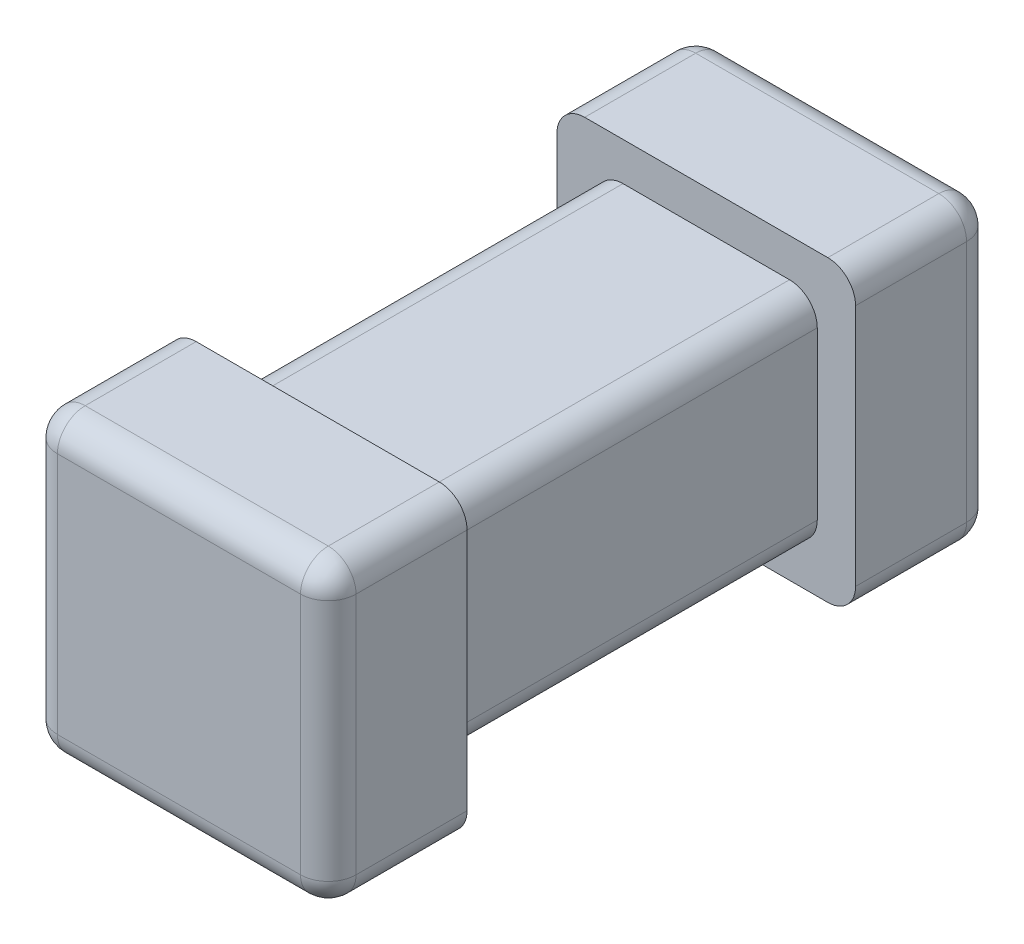
ISO-10303-21;
HEADER;
FILE_DESCRIPTION(('STEP AP214'),'2;1');
FILE_NAME('part.step','',(''),(''),'','','');
FILE_SCHEMA(('AUTOMOTIVE_DESIGN { 1 0 10303 214 1 1 1 1 }'));
ENDSEC;
DATA;
#1=APPLICATION_CONTEXT('core data for automotive mechanical design processes');
#2=APPLICATION_PROTOCOL_DEFINITION('international standard','automotive_design',2000,#1);
#3=PRODUCT_CONTEXT('',#1,'mechanical');
#4=PRODUCT('Part','Part','',(#3));
#5=PRODUCT_RELATED_PRODUCT_CATEGORY('part','',(#4));
#6=PRODUCT_DEFINITION_FORMATION('','',#4);
#7=PRODUCT_DEFINITION_CONTEXT('part definition',#1,'design');
#8=PRODUCT_DEFINITION('design','',#6,#7);
#9=PRODUCT_DEFINITION_SHAPE('','',#8);
#10=(LENGTH_UNIT() NAMED_UNIT(*) SI_UNIT(.MILLI.,.METRE.));
#11=(NAMED_UNIT(*) PLANE_ANGLE_UNIT() SI_UNIT($,.RADIAN.));
#12=(NAMED_UNIT(*) SI_UNIT($,.STERADIAN.) SOLID_ANGLE_UNIT());
#13=UNCERTAINTY_MEASURE_WITH_UNIT(LENGTH_MEASURE(1.E-05),#10,'distance_accuracy_value','');
#14=(GEOMETRIC_REPRESENTATION_CONTEXT(3) GLOBAL_UNCERTAINTY_ASSIGNED_CONTEXT((#13)) GLOBAL_UNIT_ASSIGNED_CONTEXT((#10,
#11,#12)) REPRESENTATION_CONTEXT('',''));
#15=CARTESIAN_POINT('',(0.,0.,0.));
#16=DIRECTION('',(0.,0.,1.));
#17=DIRECTION('',(1.,0.,0.));
#18=AXIS2_PLACEMENT_3D('',#15,#16,#17);
#19=CARTESIAN_POINT('',(0.,0.,0.));
#20=DIRECTION('',(0.,0.,-1.));
#21=DIRECTION('',(-1.,0.,0.));
#22=AXIS2_PLACEMENT_3D('',#19,#20,#21);
#23=PLANE('',#22);
#24=DIRECTION('',(1.,0.,0.));
#25=VECTOR('',#24,1.);
#26=CARTESIAN_POINT('',(0.,2.44,0.));
#27=LINE('',#26,#25);
#28=CARTESIAN_POINT('',(0.25,2.44,0.));
#29=VERTEX_POINT('',#28);
#30=CARTESIAN_POINT('',(2.44,2.44,0.));
#31=VERTEX_POINT('',#30);
#32=EDGE_CURVE('E260',#29,#31,#27,.T.);
#33=ORIENTED_EDGE('',*,*,#32,.F.);
#34=DIRECTION('',(0.,1.,0.));
#35=VECTOR('',#34,1.);
#36=CARTESIAN_POINT('',(0.25,0.,0.));
#37=LINE('',#36,#35);
#38=CARTESIAN_POINT('',(0.25,0.25,0.));
#39=VERTEX_POINT('',#38);
#40=EDGE_CURVE('E271',#39,#29,#37,.T.);
#41=ORIENTED_EDGE('',*,*,#40,.F.);
#42=DIRECTION('',(-1.,0.,0.));
#43=VECTOR('',#42,1.);
#44=CARTESIAN_POINT('',(0.,0.25,0.));
#45=LINE('',#44,#43);
#46=CARTESIAN_POINT('',(2.44,0.249999999999904,0.));
#47=VERTEX_POINT('',#46);
#48=EDGE_CURVE('E277',#47,#39,#45,.T.);
#49=ORIENTED_EDGE('',*,*,#48,.F.);
#50=DIRECTION('',(0.,-1.,0.));
#51=VECTOR('',#50,1.);
#52=CARTESIAN_POINT('',(2.44,0.,0.));
#53=LINE('',#52,#51);
#54=EDGE_CURVE('E265',#31,#47,#53,.T.);
#55=ORIENTED_EDGE('',*,*,#54,.F.);
#56=EDGE_LOOP('',(#33,#41,#49,#55));
#57=FACE_BOUND('',#56,.T.);
#58=ADVANCED_FACE('F16',(#57),#23,.F.);
#59=CARTESIAN_POINT('',(0.,0.,-6.));
#60=DIRECTION('',(0.,0.,1.));
#61=DIRECTION('',(1.,0.,0.));
#62=AXIS2_PLACEMENT_3D('',#59,#60,#61);
#63=PLANE('',#62);
#64=DIRECTION('',(-1.,0.,0.));
#65=VECTOR('',#64,1.);
#66=CARTESIAN_POINT('',(0.,0.25,-6.));
#67=LINE('',#66,#65);
#68=CARTESIAN_POINT('',(0.25,0.249999999999904,-6.));
#69=VERTEX_POINT('',#68);
#70=CARTESIAN_POINT('',(2.44,0.25,-6.));
#71=VERTEX_POINT('',#70);
#72=EDGE_CURVE('E442',#69,#71,#67,.F.);
#73=ORIENTED_EDGE('',*,*,#72,.F.);
#74=DIRECTION('',(0.,1.,0.));
#75=VECTOR('',#74,1.);
#76=CARTESIAN_POINT('',(0.25,0.,-6.));
#77=LINE('',#76,#75);
#78=CARTESIAN_POINT('',(0.25,2.44,-6.));
#79=VERTEX_POINT('',#78);
#80=EDGE_CURVE('E776',#79,#69,#77,.F.);
#81=ORIENTED_EDGE('',*,*,#80,.F.);
#82=DIRECTION('',(1.,0.,0.));
#83=VECTOR('',#82,1.);
#84=CARTESIAN_POINT('',(0.,2.44,-6.));
#85=LINE('',#84,#83);
#86=CARTESIAN_POINT('',(2.44,2.44,-6.));
#87=VERTEX_POINT('',#86);
#88=EDGE_CURVE('E491',#87,#79,#85,.F.);
#89=ORIENTED_EDGE('',*,*,#88,.F.);
#90=DIRECTION('',(0.,-1.,0.));
#91=VECTOR('',#90,1.);
#92=CARTESIAN_POINT('',(2.44,0.,-6.));
#93=LINE('',#92,#91);
#94=EDGE_CURVE('E243',#71,#87,#93,.F.);
#95=ORIENTED_EDGE('',*,*,#94,.F.);
#96=EDGE_LOOP('',(#73,#81,#89,#95));
#97=FACE_BOUND('',#96,.T.);
#98=ADVANCED_FACE('F320',(#97),#63,.F.);
#99=CARTESIAN_POINT('',(2.345,2.345,-3.));
#100=DIRECTION('',(-1.,0.,0.));
#101=DIRECTION('',(0.,-1.,0.));
#102=AXIS2_PLACEMENT_3D('',#99,#100,#101);
#103=PLANE('',#102);
#104=DIRECTION('',(0.,0.,1.));
#105=VECTOR('',#104,1.);
#106=CARTESIAN_POINT('',(2.345,0.595,-3.));
#107=LINE('',#106,#105);
#108=CARTESIAN_POINT('',(2.345,0.595,-4.75));
#109=VERTEX_POINT('',#108);
#110=CARTESIAN_POINT('',(2.345,0.595,-1.25));
#111=VERTEX_POINT('',#110);
#112=EDGE_CURVE('E244',#109,#111,#107,.T.);
#113=ORIENTED_EDGE('',*,*,#112,.F.);
#114=DIRECTION('',(0.,-1.,0.));
#115=VECTOR('',#114,1.);
#116=CARTESIAN_POINT('',(2.345,2.345,-4.75));
#117=LINE('',#116,#115);
#118=CARTESIAN_POINT('',(2.345,2.095,-4.75));
#119=VERTEX_POINT('',#118);
#120=EDGE_CURVE('E1109',#119,#109,#117,.T.);
#121=ORIENTED_EDGE('',*,*,#120,.F.);
#122=DIRECTION('',(0.,0.,1.));
#123=VECTOR('',#122,1.);
#124=CARTESIAN_POINT('',(2.345,2.095,-3.));
#125=LINE('',#124,#123);
#126=CARTESIAN_POINT('',(2.345,2.095,-1.25));
#127=VERTEX_POINT('',#126);
#128=EDGE_CURVE('E241',#127,#119,#125,.F.);
#129=ORIENTED_EDGE('',*,*,#128,.F.);
#130=DIRECTION('',(0.,-1.,0.));
#131=VECTOR('',#130,1.);
#132=CARTESIAN_POINT('',(2.345,2.345,-1.25));
#133=LINE('',#132,#131);
#134=EDGE_CURVE('E268',#111,#127,#133,.F.);
#135=ORIENTED_EDGE('',*,*,#134,.F.);
#136=EDGE_LOOP('',(#113,#121,#129,#135));
#137=FACE_BOUND('',#136,.T.);
#138=ADVANCED_FACE('F317',(#137),#103,.F.);
#139=CARTESIAN_POINT('',(2.44,0.,-0.25));
#140=DIRECTION('',(0.,-1.,0.));
#141=DIRECTION('',(0.,0.,-1.));
#142=AXIS2_PLACEMENT_3D('',#139,#140,#141);
#143=CYLINDRICAL_SURFACE('',#142,0.25);
#144=CARTESIAN_POINT('',(2.44,2.44,-0.25));
#145=DIRECTION('',(0.,-1.,0.));
#146=DIRECTION('',(1.,0.,0.));
#147=AXIS2_PLACEMENT_3D('',#144,#145,#146);
#148=CIRCLE('',#147,0.25);
#149=CARTESIAN_POINT('',(2.69,2.44,-0.25));
#150=VERTEX_POINT('',#149);
#151=EDGE_CURVE('E139',#31,#150,#148,.F.);
#152=ORIENTED_EDGE('',*,*,#151,.F.);
#153=ORIENTED_EDGE('',*,*,#54,.T.);
#154=CARTESIAN_POINT('',(2.44,0.25,-0.25));
#155=DIRECTION('',(0.,-1.,-1.5328734877225E-12));
#156=DIRECTION('',(1.,0.,0.));
#157=AXIS2_PLACEMENT_3D('',#154,#155,#156);
#158=CIRCLE('',#157,0.25);
#159=CARTESIAN_POINT('',(2.69,0.25,-0.25));
#160=VERTEX_POINT('',#159);
#161=EDGE_CURVE('E267',#160,#47,#158,.T.);
#162=ORIENTED_EDGE('',*,*,#161,.F.);
#163=DIRECTION('',(0.,1.,0.));
#164=VECTOR('',#163,1.);
#165=CARTESIAN_POINT('',(2.69,0.,-0.25));
#166=LINE('',#165,#164);
#167=EDGE_CURVE('E239',#150,#160,#166,.F.);
#168=ORIENTED_EDGE('',*,*,#167,.F.);
#169=EDGE_LOOP('',(#152,#153,#162,#168));
#170=FACE_BOUND('',#169,.T.);
#171=ADVANCED_FACE('F312',(#170),#143,.T.);
#172=CARTESIAN_POINT('',(2.44,0.25,-0.25));
#173=DIRECTION('',(1.,0.,0.));
#174=DIRECTION('',(0.,0.,-1.));
#175=AXIS2_PLACEMENT_3D('',#172,#173,#174);
#176=SPHERICAL_SURFACE('',#175,0.25);
#177=CARTESIAN_POINT('',(2.44,0.25,-0.25));
#178=DIRECTION('',(0.,0.,1.));
#179=DIRECTION('',(1.,0.,0.));
#180=AXIS2_PLACEMENT_3D('',#177,#178,#179);
#181=CIRCLE('',#180,0.25);
#182=CARTESIAN_POINT('',(2.44,0.,-0.25));
#183=VERTEX_POINT('',#182);
#184=EDGE_CURVE('E298',#160,#183,#181,.F.);
#185=ORIENTED_EDGE('',*,*,#184,.F.);
#186=ORIENTED_EDGE('',*,*,#161,.T.);
#187=CARTESIAN_POINT('',(2.44,0.25,-0.25));
#188=DIRECTION('',(-1.,0.,0.));
#189=DIRECTION('',(0.,0.,1.));
#190=AXIS2_PLACEMENT_3D('',#187,#188,#189);
#191=CIRCLE('',#190,0.25);
#192=EDGE_CURVE('E279',#183,#47,#191,.T.);
#193=ORIENTED_EDGE('',*,*,#192,.F.);
#194=EDGE_LOOP('',(#185,#186,#193));
#195=FACE_BOUND('',#194,.T.);
#196=ADVANCED_FACE('F307',(#195),#176,.T.);
#197=CARTESIAN_POINT('',(0.,0.25,-0.25));
#198=DIRECTION('',(-1.,0.,0.));
#199=DIRECTION('',(0.,0.,1.));
#200=AXIS2_PLACEMENT_3D('',#197,#198,#199);
#201=CYLINDRICAL_SURFACE('',#200,0.25);
#202=ORIENTED_EDGE('',*,*,#192,.T.);
#203=ORIENTED_EDGE('',*,*,#48,.T.);
#204=CARTESIAN_POINT('',(0.25,0.25,-0.25));
#205=DIRECTION('',(1.,0.,0.));
#206=DIRECTION('',(0.,0.,-1.));
#207=AXIS2_PLACEMENT_3D('',#204,#205,#206);
#208=CIRCLE('',#207,0.25);
#209=CARTESIAN_POINT('',(0.25,0.,-0.25));
#210=VERTEX_POINT('',#209);
#211=EDGE_CURVE('E278',#210,#39,#208,.F.);
#212=ORIENTED_EDGE('',*,*,#211,.F.);
#213=DIRECTION('',(1.,0.,0.));
#214=VECTOR('',#213,1.);
#215=CARTESIAN_POINT('',(0.,0.,-0.25));
#216=LINE('',#215,#214);
#217=EDGE_CURVE('E576',#183,#210,#216,.F.);
#218=ORIENTED_EDGE('',*,*,#217,.F.);
#219=EDGE_LOOP('',(#202,#203,#212,#218));
#220=FACE_BOUND('',#219,.T.);
#221=ADVANCED_FACE('F311',(#220),#201,.T.);
#222=CARTESIAN_POINT('',(0.25,0.25,-0.25));
#223=DIRECTION('',(1.,0.,0.));
#224=DIRECTION('',(0.,0.,-1.));
#225=AXIS2_PLACEMENT_3D('',#222,#223,#224);
#226=SPHERICAL_SURFACE('',#225,0.25);
#227=ORIENTED_EDGE('',*,*,#211,.T.);
#228=CARTESIAN_POINT('',(0.25,0.25,-0.25));
#229=DIRECTION('',(0.,1.,0.));
#230=DIRECTION('',(0.,0.,1.));
#231=AXIS2_PLACEMENT_3D('',#228,#229,#230);
#232=CIRCLE('',#231,0.25);
#233=CARTESIAN_POINT('',(0.,0.25,-0.25));
#234=VERTEX_POINT('',#233);
#235=EDGE_CURVE('E274',#234,#39,#232,.T.);
#236=ORIENTED_EDGE('',*,*,#235,.F.);
#237=CARTESIAN_POINT('',(0.25,0.25,-0.25));
#238=DIRECTION('',(0.,0.,1.));
#239=DIRECTION('',(1.,0.,0.));
#240=AXIS2_PLACEMENT_3D('',#237,#238,#239);
#241=CIRCLE('',#240,0.25);
#242=EDGE_CURVE('E581',#210,#234,#241,.F.);
#243=ORIENTED_EDGE('',*,*,#242,.F.);
#244=EDGE_LOOP('',(#227,#236,#243));
#245=FACE_BOUND('',#244,.T.);
#246=ADVANCED_FACE('F565',(#245),#226,.T.);
#247=CARTESIAN_POINT('',(0.25,0.,-0.25));
#248=DIRECTION('',(0.,1.,0.));
#249=DIRECTION('',(0.,0.,1.));
#250=AXIS2_PLACEMENT_3D('',#247,#248,#249);
#251=CYLINDRICAL_SURFACE('',#250,0.25);
#252=CARTESIAN_POINT('',(0.25,2.44,-0.25));
#253=DIRECTION('',(0.,-1.,0.));
#254=DIRECTION('',(1.,0.,0.));
#255=AXIS2_PLACEMENT_3D('',#252,#253,#254);
#256=CIRCLE('',#255,0.25);
#257=CARTESIAN_POINT('',(0.,2.44,-0.25));
#258=VERTEX_POINT('',#257);
#259=EDGE_CURVE('E273',#258,#29,#256,.F.);
#260=ORIENTED_EDGE('',*,*,#259,.F.);
#261=DIRECTION('',(0.,1.,0.));
#262=VECTOR('',#261,1.);
#263=CARTESIAN_POINT('',(0.,0.,-0.25));
#264=LINE('',#263,#262);
#265=EDGE_CURVE('E663',#234,#258,#264,.T.);
#266=ORIENTED_EDGE('',*,*,#265,.F.);
#267=ORIENTED_EDGE('',*,*,#235,.T.);
#268=ORIENTED_EDGE('',*,*,#40,.T.);
#269=EDGE_LOOP('',(#260,#266,#267,#268));
#270=FACE_BOUND('',#269,.T.);
#271=ADVANCED_FACE('F562',(#270),#251,.T.);
#272=CARTESIAN_POINT('',(0.25,2.44,-0.25));
#273=DIRECTION('',(1.,0.,0.));
#274=DIRECTION('',(0.,0.,-1.));
#275=AXIS2_PLACEMENT_3D('',#272,#273,#274);
#276=SPHERICAL_SURFACE('',#275,0.25);
#277=ORIENTED_EDGE('',*,*,#259,.T.);
#278=CARTESIAN_POINT('',(0.25,2.44,-0.25));
#279=DIRECTION('',(1.,0.,0.));
#280=DIRECTION('',(0.,0.,-1.));
#281=AXIS2_PLACEMENT_3D('',#278,#279,#280);
#282=CIRCLE('',#281,0.25);
#283=CARTESIAN_POINT('',(0.25,2.69,-0.25));
#284=VERTEX_POINT('',#283);
#285=EDGE_CURVE('E262',#284,#29,#282,.T.);
#286=ORIENTED_EDGE('',*,*,#285,.F.);
#287=CARTESIAN_POINT('',(0.25,2.44,-0.25));
#288=DIRECTION('',(0.,0.,1.));
#289=DIRECTION('',(1.,0.,0.));
#290=AXIS2_PLACEMENT_3D('',#287,#288,#289);
#291=CIRCLE('',#290,0.25);
#292=EDGE_CURVE('E545',#258,#284,#291,.F.);
#293=ORIENTED_EDGE('',*,*,#292,.F.);
#294=EDGE_LOOP('',(#277,#286,#293));
#295=FACE_BOUND('',#294,.T.);
#296=ADVANCED_FACE('F559',(#295),#276,.T.);
#297=CARTESIAN_POINT('',(0.,2.44,-0.25));
#298=DIRECTION('',(1.,0.,0.));
#299=DIRECTION('',(0.,0.,-1.));
#300=AXIS2_PLACEMENT_3D('',#297,#298,#299);
#301=CYLINDRICAL_SURFACE('',#300,0.25);
#302=ORIENTED_EDGE('',*,*,#285,.T.);
#303=ORIENTED_EDGE('',*,*,#32,.T.);
#304=CARTESIAN_POINT('',(2.44,2.44,-0.25));
#305=DIRECTION('',(1.,0.,0.));
#306=DIRECTION('',(0.,0.,-1.));
#307=AXIS2_PLACEMENT_3D('',#304,#305,#306);
#308=CIRCLE('',#307,0.25);
#309=CARTESIAN_POINT('',(2.44,2.69,-0.25));
#310=VERTEX_POINT('',#309);
#311=EDGE_CURVE('E255',#310,#31,#308,.T.);
#312=ORIENTED_EDGE('',*,*,#311,.F.);
#313=DIRECTION('',(1.,0.,0.));
#314=VECTOR('',#313,1.);
#315=CARTESIAN_POINT('',(0.,2.69,-0.25));
#316=LINE('',#315,#314);
#317=EDGE_CURVE('E542',#284,#310,#316,.T.);
#318=ORIENTED_EDGE('',*,*,#317,.F.);
#319=EDGE_LOOP('',(#302,#303,#312,#318));
#320=FACE_BOUND('',#319,.T.);
#321=ADVANCED_FACE('F529',(#320),#301,.T.);
#322=CARTESIAN_POINT('',(2.44,2.44,-0.25));
#323=DIRECTION('',(1.,0.,0.));
#324=DIRECTION('',(0.,0.,-1.));
#325=AXIS2_PLACEMENT_3D('',#322,#323,#324);
#326=SPHERICAL_SURFACE('',#325,0.25);
#327=CARTESIAN_POINT('',(2.44,2.44,-0.25));
#328=DIRECTION('',(0.,0.,1.));
#329=DIRECTION('',(1.,0.,0.));
#330=AXIS2_PLACEMENT_3D('',#327,#328,#329);
#331=CIRCLE('',#330,0.25);
#332=EDGE_CURVE('E649',#310,#150,#331,.F.);
#333=ORIENTED_EDGE('',*,*,#332,.F.);
#334=ORIENTED_EDGE('',*,*,#311,.T.);
#335=ORIENTED_EDGE('',*,*,#151,.T.);
#336=EDGE_LOOP('',(#333,#334,#335));
#337=FACE_BOUND('',#336,.T.);
#338=ADVANCED_FACE('F525',(#337),#326,.T.);
#339=CARTESIAN_POINT('',(2.095,0.595,-3.));
#340=DIRECTION('',(0.,0.,1.));
#341=DIRECTION('',(1.,0.,0.));
#342=AXIS2_PLACEMENT_3D('',#339,#340,#341);
#343=CYLINDRICAL_SURFACE('',#342,0.25);
#344=ORIENTED_EDGE('',*,*,#112,.T.);
#345=CARTESIAN_POINT('',(2.095,0.595,-1.25));
#346=DIRECTION('',(0.,0.,1.));
#347=DIRECTION('',(1.,0.,0.));
#348=AXIS2_PLACEMENT_3D('',#345,#346,#347);
#349=CIRCLE('',#348,0.25);
#350=CARTESIAN_POINT('',(2.095,0.345,-1.25));
#351=VERTEX_POINT('',#350);
#352=EDGE_CURVE('E242',#111,#351,#349,.F.);
#353=ORIENTED_EDGE('',*,*,#352,.T.);
#354=DIRECTION('',(0.,0.,1.));
#355=VECTOR('',#354,1.);
#356=CARTESIAN_POINT('',(2.095,0.345,-3.));
#357=LINE('',#356,#355);
#358=CARTESIAN_POINT('',(2.095,0.345,-4.75));
#359=VERTEX_POINT('',#358);
#360=EDGE_CURVE('E645',#351,#359,#357,.F.);
#361=ORIENTED_EDGE('',*,*,#360,.T.);
#362=CARTESIAN_POINT('',(2.095,0.595,-4.75));
#363=DIRECTION('',(0.,0.,1.));
#364=DIRECTION('',(1.,0.,0.));
#365=AXIS2_PLACEMENT_3D('',#362,#363,#364);
#366=CIRCLE('',#365,0.25);
#367=EDGE_CURVE('E19',#359,#109,#366,.T.);
#368=ORIENTED_EDGE('',*,*,#367,.T.);
#369=EDGE_LOOP('',(#344,#353,#361,#368));
#370=FACE_BOUND('',#369,.T.);
#371=ADVANCED_FACE('F521',(#370),#343,.T.);
#372=CARTESIAN_POINT('',(2.44,0.,-5.75));
#373=DIRECTION('',(0.,-1.,0.));
#374=DIRECTION('',(0.,0.,-1.));
#375=AXIS2_PLACEMENT_3D('',#372,#373,#374);
#376=CYLINDRICAL_SURFACE('',#375,0.25);
#377=CARTESIAN_POINT('',(2.44,2.44,-5.75));
#378=DIRECTION('',(0.,1.,0.));
#379=DIRECTION('',(1.,0.,0.));
#380=AXIS2_PLACEMENT_3D('',#377,#378,#379);
#381=CIRCLE('',#380,0.25);
#382=CARTESIAN_POINT('',(2.69,2.44,-5.75));
#383=VERTEX_POINT('',#382);
#384=EDGE_CURVE('E251',#383,#87,#381,.T.);
#385=ORIENTED_EDGE('',*,*,#384,.F.);
#386=DIRECTION('',(0.,1.,0.));
#387=VECTOR('',#386,1.);
#388=CARTESIAN_POINT('',(2.69,0.,-5.75));
#389=LINE('',#388,#387);
#390=CARTESIAN_POINT('',(2.69,0.25,-5.75));
#391=VERTEX_POINT('',#390);
#392=EDGE_CURVE('E595',#391,#383,#389,.T.);
#393=ORIENTED_EDGE('',*,*,#392,.F.);
#394=CARTESIAN_POINT('',(2.44,0.25,-5.75));
#395=DIRECTION('',(0.,1.,0.));
#396=DIRECTION('',(1.,0.,0.));
#397=AXIS2_PLACEMENT_3D('',#394,#395,#396);
#398=CIRCLE('',#397,0.25);
#399=EDGE_CURVE('E434',#71,#391,#398,.F.);
#400=ORIENTED_EDGE('',*,*,#399,.F.);
#401=ORIENTED_EDGE('',*,*,#94,.T.);
#402=EDGE_LOOP('',(#385,#393,#400,#401));
#403=FACE_BOUND('',#402,.T.);
#404=ADVANCED_FACE('F517',(#403),#376,.T.);
#405=CARTESIAN_POINT('',(2.44,2.44,-5.75));
#406=DIRECTION('',(1.,0.,0.));
#407=DIRECTION('',(0.,0.,1.));
#408=AXIS2_PLACEMENT_3D('',#405,#406,#407);
#409=SPHERICAL_SURFACE('',#408,0.25);
#410=CARTESIAN_POINT('',(2.44,2.44,-5.75));
#411=DIRECTION('',(1.,0.,0.));
#412=DIRECTION('',(0.,0.,-1.));
#413=AXIS2_PLACEMENT_3D('',#410,#411,#412);
#414=CIRCLE('',#413,0.25);
#415=CARTESIAN_POINT('',(2.44,2.69,-5.75));
#416=VERTEX_POINT('',#415);
#417=EDGE_CURVE('E506',#416,#87,#414,.F.);
#418=ORIENTED_EDGE('',*,*,#417,.F.);
#419=CARTESIAN_POINT('',(2.44,2.44,-5.75));
#420=DIRECTION('',(0.,0.,-1.));
#421=DIRECTION('',(-1.,0.,0.));
#422=AXIS2_PLACEMENT_3D('',#419,#420,#421);
#423=CIRCLE('',#422,0.25);
#424=EDGE_CURVE('E498',#383,#416,#423,.F.);
#425=ORIENTED_EDGE('',*,*,#424,.F.);
#426=ORIENTED_EDGE('',*,*,#384,.T.);
#427=EDGE_LOOP('',(#418,#425,#426));
#428=FACE_BOUND('',#427,.T.);
#429=ADVANCED_FACE('F514',(#428),#409,.T.);
#430=CARTESIAN_POINT('',(0.,2.44,-5.75));
#431=DIRECTION('',(1.,0.,0.));
#432=DIRECTION('',(0.,0.,-1.));
#433=AXIS2_PLACEMENT_3D('',#430,#431,#432);
#434=CYLINDRICAL_SURFACE('',#433,0.25);
#435=CARTESIAN_POINT('',(0.25,2.44,-5.75));
#436=DIRECTION('',(1.,0.,0.));
#437=DIRECTION('',(0.,0.,1.));
#438=AXIS2_PLACEMENT_3D('',#435,#436,#437);
#439=CIRCLE('',#438,0.25);
#440=CARTESIAN_POINT('',(0.25,2.69,-5.75));
#441=VERTEX_POINT('',#440);
#442=EDGE_CURVE('E487',#441,#79,#439,.F.);
#443=ORIENTED_EDGE('',*,*,#442,.F.);
#444=DIRECTION('',(1.,0.,0.));
#445=VECTOR('',#444,1.);
#446=CARTESIAN_POINT('',(0.,2.69,-5.75));
#447=LINE('',#446,#445);
#448=EDGE_CURVE('E494',#416,#441,#447,.F.);
#449=ORIENTED_EDGE('',*,*,#448,.F.);
#450=ORIENTED_EDGE('',*,*,#417,.T.);
#451=ORIENTED_EDGE('',*,*,#88,.T.);
#452=EDGE_LOOP('',(#443,#449,#450,#451));
#453=FACE_BOUND('',#452,.T.);
#454=ADVANCED_FACE('F479',(#453),#434,.T.);
#455=CARTESIAN_POINT('',(0.25,2.44,-5.75));
#456=DIRECTION('',(1.,0.,0.));
#457=DIRECTION('',(0.,0.,1.));
#458=AXIS2_PLACEMENT_3D('',#455,#456,#457);
#459=SPHERICAL_SURFACE('',#458,0.25);
#460=ORIENTED_EDGE('',*,*,#442,.T.);
#461=CARTESIAN_POINT('',(0.25,2.44,-5.75));
#462=DIRECTION('',(0.,1.,0.));
#463=DIRECTION('',(0.,0.,1.));
#464=AXIS2_PLACEMENT_3D('',#461,#462,#463);
#465=CIRCLE('',#464,0.25);
#466=CARTESIAN_POINT('',(0.,2.44,-5.75));
#467=VERTEX_POINT('',#466);
#468=EDGE_CURVE('E490',#467,#79,#465,.F.);
#469=ORIENTED_EDGE('',*,*,#468,.F.);
#470=CARTESIAN_POINT('',(0.25,2.44,-5.75));
#471=DIRECTION('',(0.,0.,-1.));
#472=DIRECTION('',(-1.,0.,0.));
#473=AXIS2_PLACEMENT_3D('',#470,#471,#472);
#474=CIRCLE('',#473,0.25);
#475=EDGE_CURVE('E628',#441,#467,#474,.F.);
#476=ORIENTED_EDGE('',*,*,#475,.F.);
#477=EDGE_LOOP('',(#460,#469,#476));
#478=FACE_BOUND('',#477,.T.);
#479=ADVANCED_FACE('F474',(#478),#459,.T.);
#480=CARTESIAN_POINT('',(0.25,0.,-5.75));
#481=DIRECTION('',(0.,1.,0.));
#482=DIRECTION('',(0.,0.,1.));
#483=AXIS2_PLACEMENT_3D('',#480,#481,#482);
#484=CYLINDRICAL_SURFACE('',#483,0.25);
#485=ORIENTED_EDGE('',*,*,#468,.T.);
#486=ORIENTED_EDGE('',*,*,#80,.T.);
#487=CARTESIAN_POINT('',(0.25,0.25,-5.75));
#488=DIRECTION('',(0.,1.,-1.53311841708233E-12));
#489=DIRECTION('',(1.,0.,0.));
#490=AXIS2_PLACEMENT_3D('',#487,#488,#489);
#491=CIRCLE('',#490,0.25);
#492=CARTESIAN_POINT('',(0.,0.25,-5.75));
#493=VERTEX_POINT('',#492);
#494=EDGE_CURVE('E455',#493,#69,#491,.F.);
#495=ORIENTED_EDGE('',*,*,#494,.F.);
#496=DIRECTION('',(0.,1.,0.));
#497=VECTOR('',#496,1.);
#498=CARTESIAN_POINT('',(0.,0.,-5.75));
#499=LINE('',#498,#497);
#500=EDGE_CURVE('E622',#467,#493,#499,.F.);
#501=ORIENTED_EDGE('',*,*,#500,.F.);
#502=EDGE_LOOP('',(#485,#486,#495,#501));
#503=FACE_BOUND('',#502,.T.);
#504=ADVANCED_FACE('F470',(#503),#484,.T.);
#505=CARTESIAN_POINT('',(0.25,0.25,-5.75));
#506=DIRECTION('',(1.,0.,0.));
#507=DIRECTION('',(0.,0.,1.));
#508=AXIS2_PLACEMENT_3D('',#505,#506,#507);
#509=SPHERICAL_SURFACE('',#508,0.25);
#510=ORIENTED_EDGE('',*,*,#494,.T.);
#511=CARTESIAN_POINT('',(0.25,0.25,-5.75));
#512=DIRECTION('',(-1.,0.,0.));
#513=DIRECTION('',(0.,0.,1.));
#514=AXIS2_PLACEMENT_3D('',#511,#512,#513);
#515=CIRCLE('',#514,0.25);
#516=CARTESIAN_POINT('',(0.25,0.,-5.75));
#517=VERTEX_POINT('',#516);
#518=EDGE_CURVE('E452',#517,#69,#515,.F.);
#519=ORIENTED_EDGE('',*,*,#518,.F.);
#520=CARTESIAN_POINT('',(0.25,0.25,-5.75));
#521=DIRECTION('',(0.,0.,-1.));
#522=DIRECTION('',(-1.,0.,0.));
#523=AXIS2_PLACEMENT_3D('',#520,#521,#522);
#524=CIRCLE('',#523,0.25);
#525=EDGE_CURVE('E458',#493,#517,#524,.F.);
#526=ORIENTED_EDGE('',*,*,#525,.F.);
#527=EDGE_LOOP('',(#510,#519,#526));
#528=FACE_BOUND('',#527,.T.);
#529=ADVANCED_FACE('F467',(#528),#509,.T.);
#530=CARTESIAN_POINT('',(0.,0.25,-5.75));
#531=DIRECTION('',(-1.,0.,0.));
#532=DIRECTION('',(0.,0.,1.));
#533=AXIS2_PLACEMENT_3D('',#530,#531,#532);
#534=CYLINDRICAL_SURFACE('',#533,0.25);
#535=CARTESIAN_POINT('',(2.44,0.25,-5.75));
#536=DIRECTION('',(1.,0.,0.));
#537=DIRECTION('',(0.,0.,1.));
#538=AXIS2_PLACEMENT_3D('',#535,#536,#537);
#539=CIRCLE('',#538,0.25);
#540=CARTESIAN_POINT('',(2.44,0.,-5.75));
#541=VERTEX_POINT('',#540);
#542=EDGE_CURVE('E437',#541,#71,#539,.T.);
#543=ORIENTED_EDGE('',*,*,#542,.F.);
#544=DIRECTION('',(1.,0.,0.));
#545=VECTOR('',#544,1.);
#546=CARTESIAN_POINT('',(0.,0.,-5.75));
#547=LINE('',#546,#545);
#548=EDGE_CURVE('E445',#517,#541,#547,.T.);
#549=ORIENTED_EDGE('',*,*,#548,.F.);
#550=ORIENTED_EDGE('',*,*,#518,.T.);
#551=ORIENTED_EDGE('',*,*,#72,.T.);
#552=EDGE_LOOP('',(#543,#549,#550,#551));
#553=FACE_BOUND('',#552,.T.);
#554=ADVANCED_FACE('F426',(#553),#534,.T.);
#555=CARTESIAN_POINT('',(2.44,0.25,-5.75));
#556=DIRECTION('',(1.,0.,0.));
#557=DIRECTION('',(0.,0.,1.));
#558=AXIS2_PLACEMENT_3D('',#555,#556,#557);
#559=SPHERICAL_SURFACE('',#558,0.25);
#560=ORIENTED_EDGE('',*,*,#399,.T.);
#561=CARTESIAN_POINT('',(2.44,0.25,-5.75));
#562=DIRECTION('',(0.,0.,-1.));
#563=DIRECTION('',(-1.,0.,0.));
#564=AXIS2_PLACEMENT_3D('',#561,#562,#563);
#565=CIRCLE('',#564,0.25);
#566=EDGE_CURVE('E599',#541,#391,#565,.F.);
#567=ORIENTED_EDGE('',*,*,#566,.F.);
#568=ORIENTED_EDGE('',*,*,#542,.T.);
#569=EDGE_LOOP('',(#560,#567,#568));
#570=FACE_BOUND('',#569,.T.);
#571=ADVANCED_FACE('F421',(#570),#559,.T.);
#572=CARTESIAN_POINT('',(2.095,2.095,-3.));
#573=DIRECTION('',(0.,0.,1.));
#574=DIRECTION('',(1.,0.,0.));
#575=AXIS2_PLACEMENT_3D('',#572,#573,#574);
#576=CYLINDRICAL_SURFACE('',#575,0.25);
#577=DIRECTION('',(0.,0.,-1.));
#578=VECTOR('',#577,1.);
#579=CARTESIAN_POINT('',(2.095,2.345,-3.));
#580=LINE('',#579,#578);
#581=CARTESIAN_POINT('',(2.095,2.345,-4.75));
#582=VERTEX_POINT('',#581);
#583=CARTESIAN_POINT('',(2.095,2.345,-1.25));
#584=VERTEX_POINT('',#583);
#585=EDGE_CURVE('E194',#582,#584,#580,.F.);
#586=ORIENTED_EDGE('',*,*,#585,.T.);
#587=CARTESIAN_POINT('',(2.095,2.095,-1.25));
#588=DIRECTION('',(0.,0.,1.));
#589=DIRECTION('',(1.,0.,0.));
#590=AXIS2_PLACEMENT_3D('',#587,#588,#589);
#591=CIRCLE('',#590,0.25);
#592=EDGE_CURVE('E236',#584,#127,#591,.F.);
#593=ORIENTED_EDGE('',*,*,#592,.T.);
#594=ORIENTED_EDGE('',*,*,#128,.T.);
#595=CARTESIAN_POINT('',(2.095,2.095,-4.75));
#596=DIRECTION('',(0.,0.,1.));
#597=DIRECTION('',(1.,0.,0.));
#598=AXIS2_PLACEMENT_3D('',#595,#596,#597);
#599=CIRCLE('',#598,0.25);
#600=EDGE_CURVE('E240',#119,#582,#599,.T.);
#601=ORIENTED_EDGE('',*,*,#600,.T.);
#602=EDGE_LOOP('',(#586,#593,#594,#601));
#603=FACE_BOUND('',#602,.T.);
#604=ADVANCED_FACE('F417',(#603),#576,.T.);
#605=CARTESIAN_POINT('',(2.69,0.,-1.25));
#606=DIRECTION('',(1.,0.,0.));
#607=DIRECTION('',(0.,0.,-1.));
#608=AXIS2_PLACEMENT_3D('',#605,#606,#607);
#609=PLANE('',#608);
#610=DIRECTION('',(0.,1.,0.));
#611=VECTOR('',#610,1.);
#612=CARTESIAN_POINT('',(2.69,0.,-1.25));
#613=LINE('',#612,#611);
#614=CARTESIAN_POINT('',(2.69,2.44,-1.25));
#615=VERTEX_POINT('',#614);
#616=CARTESIAN_POINT('',(2.69,0.25,-1.25));
#617=VERTEX_POINT('',#616);
#618=EDGE_CURVE('E235',#615,#617,#613,.F.);
#619=ORIENTED_EDGE('',*,*,#618,.F.);
#620=DIRECTION('',(0.,0.,1.));
#621=VECTOR('',#620,1.);
#622=CARTESIAN_POINT('',(2.69,2.44,-1.25));
#623=LINE('',#622,#621);
#624=EDGE_CURVE('E647',#150,#615,#623,.F.);
#625=ORIENTED_EDGE('',*,*,#624,.F.);
#626=ORIENTED_EDGE('',*,*,#167,.T.);
#627=DIRECTION('',(0.,0.,1.));
#628=VECTOR('',#627,1.);
#629=CARTESIAN_POINT('',(2.69,0.25,-1.25));
#630=LINE('',#629,#628);
#631=EDGE_CURVE('E301',#617,#160,#630,.T.);
#632=ORIENTED_EDGE('',*,*,#631,.F.);
#633=EDGE_LOOP('',(#619,#625,#626,#632));
#634=FACE_BOUND('',#633,.T.);
#635=ADVANCED_FACE('F413',(#634),#609,.T.);
#636=CARTESIAN_POINT('',(2.44,0.25,-1.25));
#637=DIRECTION('',(0.,0.,1.));
#638=DIRECTION('',(1.,0.,0.));
#639=AXIS2_PLACEMENT_3D('',#636,#637,#638);
#640=CYLINDRICAL_SURFACE('',#639,0.25);
#641=ORIENTED_EDGE('',*,*,#184,.T.);
#642=DIRECTION('',(0.,0.,-1.));
#643=VECTOR('',#642,1.);
#644=CARTESIAN_POINT('',(2.44,0.,-1.25));
#645=LINE('',#644,#643);
#646=CARTESIAN_POINT('',(2.44,0.,-1.25));
#647=VERTEX_POINT('',#646);
#648=EDGE_CURVE('E300',#647,#183,#645,.F.);
#649=ORIENTED_EDGE('',*,*,#648,.F.);
#650=CARTESIAN_POINT('',(2.44,0.25,-1.25));
#651=DIRECTION('',(0.,0.,1.));
#652=DIRECTION('',(1.,0.,0.));
#653=AXIS2_PLACEMENT_3D('',#650,#651,#652);
#654=CIRCLE('',#653,0.25);
#655=EDGE_CURVE('E233',#617,#647,#654,.F.);
#656=ORIENTED_EDGE('',*,*,#655,.F.);
#657=ORIENTED_EDGE('',*,*,#631,.T.);
#658=EDGE_LOOP('',(#641,#649,#656,#657));
#659=FACE_BOUND('',#658,.T.);
#660=ADVANCED_FACE('F409',(#659),#640,.T.);
#661=CARTESIAN_POINT('',(0.,0.,-1.25));
#662=DIRECTION('',(0.,-1.,0.));
#663=DIRECTION('',(0.,0.,-1.));
#664=AXIS2_PLACEMENT_3D('',#661,#662,#663);
#665=PLANE('',#664);
#666=ORIENTED_EDGE('',*,*,#217,.T.);
#667=DIRECTION('',(0.,0.,1.));
#668=VECTOR('',#667,1.);
#669=CARTESIAN_POINT('',(0.25,0.,-1.25));
#670=LINE('',#669,#668);
#671=CARTESIAN_POINT('',(0.25,0.,-1.25));
#672=VERTEX_POINT('',#671);
#673=EDGE_CURVE('E577',#672,#210,#670,.T.);
#674=ORIENTED_EDGE('',*,*,#673,.F.);
#675=DIRECTION('',(-1.,0.,0.));
#676=VECTOR('',#675,1.);
#677=CARTESIAN_POINT('',(0.,0.,-1.25));
#678=LINE('',#677,#676);
#679=EDGE_CURVE('E232',#647,#672,#678,.T.);
#680=ORIENTED_EDGE('',*,*,#679,.F.);
#681=ORIENTED_EDGE('',*,*,#648,.T.);
#682=EDGE_LOOP('',(#666,#674,#680,#681));
#683=FACE_BOUND('',#682,.T.);
#684=ADVANCED_FACE('F405',(#683),#665,.T.);
#685=CARTESIAN_POINT('',(0.25,0.25,-1.25));
#686=DIRECTION('',(0.,0.,1.));
#687=DIRECTION('',(1.,0.,0.));
#688=AXIS2_PLACEMENT_3D('',#685,#686,#687);
#689=CYLINDRICAL_SURFACE('',#688,0.25);
#690=ORIENTED_EDGE('',*,*,#242,.T.);
#691=DIRECTION('',(0.,0.,1.));
#692=VECTOR('',#691,1.);
#693=CARTESIAN_POINT('',(0.,0.25,-1.25));
#694=LINE('',#693,#692);
#695=CARTESIAN_POINT('',(0.,0.25,-1.25));
#696=VERTEX_POINT('',#695);
#697=EDGE_CURVE('E666',#696,#234,#694,.T.);
#698=ORIENTED_EDGE('',*,*,#697,.F.);
#699=CARTESIAN_POINT('',(0.25,0.25,-1.25));
#700=DIRECTION('',(0.,0.,1.));
#701=DIRECTION('',(1.,0.,0.));
#702=AXIS2_PLACEMENT_3D('',#699,#700,#701);
#703=CIRCLE('',#702,0.25);
#704=EDGE_CURVE('E230',#672,#696,#703,.F.);
#705=ORIENTED_EDGE('',*,*,#704,.F.);
#706=ORIENTED_EDGE('',*,*,#673,.T.);
#707=EDGE_LOOP('',(#690,#698,#705,#706));
#708=FACE_BOUND('',#707,.T.);
#709=ADVANCED_FACE('F401',(#708),#689,.T.);
#710=CARTESIAN_POINT('',(0.,0.,-1.25));
#711=DIRECTION('',(-1.,0.,0.));
#712=DIRECTION('',(0.,0.,1.));
#713=AXIS2_PLACEMENT_3D('',#710,#711,#712);
#714=PLANE('',#713);
#715=ORIENTED_EDGE('',*,*,#265,.T.);
#716=DIRECTION('',(0.,0.,1.));
#717=VECTOR('',#716,1.);
#718=CARTESIAN_POINT('',(0.,2.44,-1.25));
#719=LINE('',#718,#717);
#720=CARTESIAN_POINT('',(0.,2.44,-1.25));
#721=VERTEX_POINT('',#720);
#722=EDGE_CURVE('E549',#721,#258,#719,.T.);
#723=ORIENTED_EDGE('',*,*,#722,.F.);
#724=DIRECTION('',(0.,1.,0.));
#725=VECTOR('',#724,1.);
#726=CARTESIAN_POINT('',(0.,0.,-1.25));
#727=LINE('',#726,#725);
#728=EDGE_CURVE('E229',#696,#721,#727,.T.);
#729=ORIENTED_EDGE('',*,*,#728,.F.);
#730=ORIENTED_EDGE('',*,*,#697,.T.);
#731=EDGE_LOOP('',(#715,#723,#729,#730));
#732=FACE_BOUND('',#731,.T.);
#733=ADVANCED_FACE('F397',(#732),#714,.T.);
#734=CARTESIAN_POINT('',(0.25,2.44,-1.25));
#735=DIRECTION('',(0.,0.,1.));
#736=DIRECTION('',(1.,0.,0.));
#737=AXIS2_PLACEMENT_3D('',#734,#735,#736);
#738=CYLINDRICAL_SURFACE('',#737,0.25);
#739=ORIENTED_EDGE('',*,*,#292,.T.);
#740=DIRECTION('',(0.,0.,1.));
#741=VECTOR('',#740,1.);
#742=CARTESIAN_POINT('',(0.25,2.69,-1.25));
#743=LINE('',#742,#741);
#744=CARTESIAN_POINT('',(0.25,2.69,-1.25));
#745=VERTEX_POINT('',#744);
#746=EDGE_CURVE('E544',#745,#284,#743,.T.);
#747=ORIENTED_EDGE('',*,*,#746,.F.);
#748=CARTESIAN_POINT('',(0.25,2.44,-1.25));
#749=DIRECTION('',(0.,0.,1.));
#750=DIRECTION('',(1.,0.,0.));
#751=AXIS2_PLACEMENT_3D('',#748,#749,#750);
#752=CIRCLE('',#751,0.25);
#753=EDGE_CURVE('E227',#721,#745,#752,.F.);
#754=ORIENTED_EDGE('',*,*,#753,.F.);
#755=ORIENTED_EDGE('',*,*,#722,.T.);
#756=EDGE_LOOP('',(#739,#747,#754,#755));
#757=FACE_BOUND('',#756,.T.);
#758=ADVANCED_FACE('F393',(#757),#738,.T.);
#759=CARTESIAN_POINT('',(0.,2.69,-1.25));
#760=DIRECTION('',(0.,1.,0.));
#761=DIRECTION('',(0.,0.,1.));
#762=AXIS2_PLACEMENT_3D('',#759,#760,#761);
#763=PLANE('',#762);
#764=DIRECTION('',(-1.,0.,0.));
#765=VECTOR('',#764,1.);
#766=CARTESIAN_POINT('',(0.,2.69,-1.25));
#767=LINE('',#766,#765);
#768=CARTESIAN_POINT('',(2.44,2.69,-1.25));
#769=VERTEX_POINT('',#768);
#770=EDGE_CURVE('E226',#745,#769,#767,.F.);
#771=ORIENTED_EDGE('',*,*,#770,.F.);
#772=ORIENTED_EDGE('',*,*,#746,.T.);
#773=ORIENTED_EDGE('',*,*,#317,.T.);
#774=DIRECTION('',(0.,0.,1.));
#775=VECTOR('',#774,1.);
#776=CARTESIAN_POINT('',(2.44,2.69,-1.25));
#777=LINE('',#776,#775);
#778=EDGE_CURVE('E652',#769,#310,#777,.T.);
#779=ORIENTED_EDGE('',*,*,#778,.F.);
#780=EDGE_LOOP('',(#771,#772,#773,#779));
#781=FACE_BOUND('',#780,.T.);
#782=ADVANCED_FACE('F389',(#781),#763,.T.);
#783=CARTESIAN_POINT('',(2.44,2.44,-1.25));
#784=DIRECTION('',(0.,0.,1.));
#785=DIRECTION('',(1.,0.,0.));
#786=AXIS2_PLACEMENT_3D('',#783,#784,#785);
#787=CYLINDRICAL_SURFACE('',#786,0.25);
#788=ORIENTED_EDGE('',*,*,#332,.T.);
#789=ORIENTED_EDGE('',*,*,#624,.T.);
#790=CARTESIAN_POINT('',(2.44,2.44,-1.25));
#791=DIRECTION('',(0.,0.,1.));
#792=DIRECTION('',(1.,0.,0.));
#793=AXIS2_PLACEMENT_3D('',#790,#791,#792);
#794=CIRCLE('',#793,0.25);
#795=EDGE_CURVE('E223',#769,#615,#794,.F.);
#796=ORIENTED_EDGE('',*,*,#795,.F.);
#797=ORIENTED_EDGE('',*,*,#778,.T.);
#798=EDGE_LOOP('',(#788,#789,#796,#797));
#799=FACE_BOUND('',#798,.T.);
#800=ADVANCED_FACE('F385',(#799),#787,.T.);
#801=CARTESIAN_POINT('',(0.345,0.345,-3.));
#802=DIRECTION('',(0.,1.,0.));
#803=DIRECTION('',(-1.,0.,0.));
#804=AXIS2_PLACEMENT_3D('',#801,#802,#803);
#805=PLANE('',#804);
#806=DIRECTION('',(-1.,0.,0.));
#807=VECTOR('',#806,1.);
#808=CARTESIAN_POINT('',(0.345,0.345,-4.75));
#809=LINE('',#808,#807);
#810=CARTESIAN_POINT('',(0.595,0.345,-4.75));
#811=VERTEX_POINT('',#810);
#812=EDGE_CURVE('E597',#359,#811,#809,.T.);
#813=ORIENTED_EDGE('',*,*,#812,.F.);
#814=ORIENTED_EDGE('',*,*,#360,.F.);
#815=DIRECTION('',(-1.,0.,0.));
#816=VECTOR('',#815,1.);
#817=CARTESIAN_POINT('',(0.,0.345,-1.25));
#818=LINE('',#817,#816);
#819=CARTESIAN_POINT('',(0.595,0.345,-1.25));
#820=VERTEX_POINT('',#819);
#821=EDGE_CURVE('E706',#820,#351,#818,.F.);
#822=ORIENTED_EDGE('',*,*,#821,.F.);
#823=DIRECTION('',(0.,0.,1.));
#824=VECTOR('',#823,1.);
#825=CARTESIAN_POINT('',(0.595,0.345,-3.));
#826=LINE('',#825,#824);
#827=EDGE_CURVE('E222',#811,#820,#826,.T.);
#828=ORIENTED_EDGE('',*,*,#827,.F.);
#829=EDGE_LOOP('',(#813,#814,#822,#828));
#830=FACE_BOUND('',#829,.T.);
#831=ADVANCED_FACE('F381',(#830),#805,.F.);
#832=CARTESIAN_POINT('',(2.69,0.,-4.75));
#833=DIRECTION('',(1.,0.,0.));
#834=DIRECTION('',(0.,0.,-1.));
#835=AXIS2_PLACEMENT_3D('',#832,#833,#834);
#836=PLANE('',#835);
#837=DIRECTION('',(0.,1.,0.));
#838=VECTOR('',#837,1.);
#839=CARTESIAN_POINT('',(2.69,0.,-4.75));
#840=LINE('',#839,#838);
#841=CARTESIAN_POINT('',(2.69,0.25,-4.75));
#842=VERTEX_POINT('',#841);
#843=CARTESIAN_POINT('',(2.69,2.44,-4.75));
#844=VERTEX_POINT('',#843);
#845=EDGE_CURVE('E219',#842,#844,#840,.T.);
#846=ORIENTED_EDGE('',*,*,#845,.F.);
#847=DIRECTION('',(0.,0.,-1.));
#848=VECTOR('',#847,1.);
#849=CARTESIAN_POINT('',(2.69,0.25,-4.75));
#850=LINE('',#849,#848);
#851=EDGE_CURVE('E601',#391,#842,#850,.F.);
#852=ORIENTED_EDGE('',*,*,#851,.F.);
#853=ORIENTED_EDGE('',*,*,#392,.T.);
#854=DIRECTION('',(0.,0.,-1.));
#855=VECTOR('',#854,1.);
#856=CARTESIAN_POINT('',(2.69,2.44,-4.75));
#857=LINE('',#856,#855);
#858=EDGE_CURVE('E503',#844,#383,#857,.T.);
#859=ORIENTED_EDGE('',*,*,#858,.F.);
#860=EDGE_LOOP('',(#846,#852,#853,#859));
#861=FACE_BOUND('',#860,.T.);
#862=ADVANCED_FACE('F377',(#861),#836,.T.);
#863=CARTESIAN_POINT('',(2.44,2.44,-4.75));
#864=DIRECTION('',(0.,0.,-1.));
#865=DIRECTION('',(-1.,0.,0.));
#866=AXIS2_PLACEMENT_3D('',#863,#864,#865);
#867=CYLINDRICAL_SURFACE('',#866,0.25);
#868=ORIENTED_EDGE('',*,*,#424,.T.);
#869=DIRECTION('',(0.,0.,1.));
#870=VECTOR('',#869,1.);
#871=CARTESIAN_POINT('',(2.44,2.69,-4.75));
#872=LINE('',#871,#870);
#873=CARTESIAN_POINT('',(2.44,2.69,-4.75));
#874=VERTEX_POINT('',#873);
#875=EDGE_CURVE('E497',#874,#416,#872,.F.);
#876=ORIENTED_EDGE('',*,*,#875,.F.);
#877=CARTESIAN_POINT('',(2.44,2.44,-4.75));
#878=DIRECTION('',(0.,0.,-1.));
#879=DIRECTION('',(-1.,0.,0.));
#880=AXIS2_PLACEMENT_3D('',#877,#878,#879);
#881=CIRCLE('',#880,0.25);
#882=EDGE_CURVE('E217',#844,#874,#881,.F.);
#883=ORIENTED_EDGE('',*,*,#882,.F.);
#884=ORIENTED_EDGE('',*,*,#858,.T.);
#885=EDGE_LOOP('',(#868,#876,#883,#884));
#886=FACE_BOUND('',#885,.T.);
#887=ADVANCED_FACE('F373',(#886),#867,.T.);
#888=CARTESIAN_POINT('',(0.,2.69,-4.75));
#889=DIRECTION('',(0.,1.,0.));
#890=DIRECTION('',(0.,0.,1.));
#891=AXIS2_PLACEMENT_3D('',#888,#889,#890);
#892=PLANE('',#891);
#893=DIRECTION('',(1.,0.,0.));
#894=VECTOR('',#893,1.);
#895=CARTESIAN_POINT('',(0.,2.69,-4.75));
#896=LINE('',#895,#894);
#897=CARTESIAN_POINT('',(0.25,2.69,-4.75));
#898=VERTEX_POINT('',#897);
#899=EDGE_CURVE('E216',#874,#898,#896,.F.);
#900=ORIENTED_EDGE('',*,*,#899,.F.);
#901=ORIENTED_EDGE('',*,*,#875,.T.);
#902=ORIENTED_EDGE('',*,*,#448,.T.);
#903=DIRECTION('',(0.,0.,-1.));
#904=VECTOR('',#903,1.);
#905=CARTESIAN_POINT('',(0.25,2.69,-4.75));
#906=LINE('',#905,#904);
#907=EDGE_CURVE('E631',#898,#441,#906,.T.);
#908=ORIENTED_EDGE('',*,*,#907,.F.);
#909=EDGE_LOOP('',(#900,#901,#902,#908));
#910=FACE_BOUND('',#909,.T.);
#911=ADVANCED_FACE('F369',(#910),#892,.T.);
#912=CARTESIAN_POINT('',(0.25,2.44,-4.75));
#913=DIRECTION('',(0.,0.,-1.));
#914=DIRECTION('',(-1.,0.,0.));
#915=AXIS2_PLACEMENT_3D('',#912,#913,#914);
#916=CYLINDRICAL_SURFACE('',#915,0.25);
#917=ORIENTED_EDGE('',*,*,#475,.T.);
#918=DIRECTION('',(0.,0.,1.));
#919=VECTOR('',#918,1.);
#920=CARTESIAN_POINT('',(0.,2.44,-4.75));
#921=LINE('',#920,#919);
#922=CARTESIAN_POINT('',(0.,2.44,-4.75));
#923=VERTEX_POINT('',#922);
#924=EDGE_CURVE('E625',#923,#467,#921,.F.);
#925=ORIENTED_EDGE('',*,*,#924,.F.);
#926=CARTESIAN_POINT('',(0.25,2.44,-4.75));
#927=DIRECTION('',(0.,0.,-1.));
#928=DIRECTION('',(-1.,0.,0.));
#929=AXIS2_PLACEMENT_3D('',#926,#927,#928);
#930=CIRCLE('',#929,0.25);
#931=EDGE_CURVE('E214',#898,#923,#930,.F.);
#932=ORIENTED_EDGE('',*,*,#931,.F.);
#933=ORIENTED_EDGE('',*,*,#907,.T.);
#934=EDGE_LOOP('',(#917,#925,#932,#933));
#935=FACE_BOUND('',#934,.T.);
#936=ADVANCED_FACE('F365',(#935),#916,.T.);
#937=CARTESIAN_POINT('',(0.,0.,-4.75));
#938=DIRECTION('',(-1.,0.,0.));
#939=DIRECTION('',(0.,0.,1.));
#940=AXIS2_PLACEMENT_3D('',#937,#938,#939);
#941=PLANE('',#940);
#942=ORIENTED_EDGE('',*,*,#500,.T.);
#943=DIRECTION('',(0.,0.,-1.));
#944=VECTOR('',#943,1.);
#945=CARTESIAN_POINT('',(0.,0.25,-4.75));
#946=LINE('',#945,#944);
#947=CARTESIAN_POINT('',(0.,0.25,-4.75));
#948=VERTEX_POINT('',#947);
#949=EDGE_CURVE('E461',#948,#493,#946,.T.);
#950=ORIENTED_EDGE('',*,*,#949,.F.);
#951=DIRECTION('',(0.,1.,0.));
#952=VECTOR('',#951,1.);
#953=CARTESIAN_POINT('',(0.,0.,-4.75));
#954=LINE('',#953,#952);
#955=EDGE_CURVE('E213',#923,#948,#954,.F.);
#956=ORIENTED_EDGE('',*,*,#955,.F.);
#957=ORIENTED_EDGE('',*,*,#924,.T.);
#958=EDGE_LOOP('',(#942,#950,#956,#957));
#959=FACE_BOUND('',#958,.T.);
#960=ADVANCED_FACE('F361',(#959),#941,.T.);
#961=CARTESIAN_POINT('',(0.25,0.25,-4.75));
#962=DIRECTION('',(0.,0.,-1.));
#963=DIRECTION('',(-1.,0.,0.));
#964=AXIS2_PLACEMENT_3D('',#961,#962,#963);
#965=CYLINDRICAL_SURFACE('',#964,0.25);
#966=ORIENTED_EDGE('',*,*,#525,.T.);
#967=DIRECTION('',(0.,0.,-1.));
#968=VECTOR('',#967,1.);
#969=CARTESIAN_POINT('',(0.25,0.,-4.75));
#970=LINE('',#969,#968);
#971=CARTESIAN_POINT('',(0.25,0.,-4.75));
#972=VERTEX_POINT('',#971);
#973=EDGE_CURVE('E449',#972,#517,#970,.T.);
#974=ORIENTED_EDGE('',*,*,#973,.F.);
#975=CARTESIAN_POINT('',(0.25,0.25,-4.75));
#976=DIRECTION('',(0.,0.,-1.));
#977=DIRECTION('',(-1.,0.,0.));
#978=AXIS2_PLACEMENT_3D('',#975,#976,#977);
#979=CIRCLE('',#978,0.25);
#980=EDGE_CURVE('E211',#948,#972,#979,.F.);
#981=ORIENTED_EDGE('',*,*,#980,.F.);
#982=ORIENTED_EDGE('',*,*,#949,.T.);
#983=EDGE_LOOP('',(#966,#974,#981,#982));
#984=FACE_BOUND('',#983,.T.);
#985=ADVANCED_FACE('F357',(#984),#965,.T.);
#986=CARTESIAN_POINT('',(0.,0.,-4.75));
#987=DIRECTION('',(0.,-1.,0.));
#988=DIRECTION('',(0.,0.,-1.));
#989=AXIS2_PLACEMENT_3D('',#986,#987,#988);
#990=PLANE('',#989);
#991=ORIENTED_EDGE('',*,*,#548,.T.);
#992=DIRECTION('',(0.,0.,-1.));
#993=VECTOR('',#992,1.);
#994=CARTESIAN_POINT('',(2.44,0.,-4.75));
#995=LINE('',#994,#993);
#996=CARTESIAN_POINT('',(2.44,0.,-4.75));
#997=VERTEX_POINT('',#996);
#998=EDGE_CURVE('E448',#997,#541,#995,.T.);
#999=ORIENTED_EDGE('',*,*,#998,.F.);
#1000=DIRECTION('',(1.,0.,0.));
#1001=VECTOR('',#1000,1.);
#1002=CARTESIAN_POINT('',(0.,0.,-4.75));
#1003=LINE('',#1002,#1001);
#1004=EDGE_CURVE('E210',#972,#997,#1003,.T.);
#1005=ORIENTED_EDGE('',*,*,#1004,.F.);
#1006=ORIENTED_EDGE('',*,*,#973,.T.);
#1007=EDGE_LOOP('',(#991,#999,#1005,#1006));
#1008=FACE_BOUND('',#1007,.T.);
#1009=ADVANCED_FACE('F353',(#1008),#990,.T.);
#1010=CARTESIAN_POINT('',(2.44,0.25,-4.75));
#1011=DIRECTION('',(0.,0.,-1.));
#1012=DIRECTION('',(-1.,0.,0.));
#1013=AXIS2_PLACEMENT_3D('',#1010,#1011,#1012);
#1014=CYLINDRICAL_SURFACE('',#1013,0.25);
#1015=ORIENTED_EDGE('',*,*,#566,.T.);
#1016=ORIENTED_EDGE('',*,*,#851,.T.);
#1017=CARTESIAN_POINT('',(2.44,0.25,-4.75));
#1018=DIRECTION('',(0.,0.,-1.));
#1019=DIRECTION('',(-1.,0.,0.));
#1020=AXIS2_PLACEMENT_3D('',#1017,#1018,#1019);
#1021=CIRCLE('',#1020,0.25);
#1022=EDGE_CURVE('E196',#997,#842,#1021,.F.);
#1023=ORIENTED_EDGE('',*,*,#1022,.F.);
#1024=ORIENTED_EDGE('',*,*,#998,.T.);
#1025=EDGE_LOOP('',(#1015,#1016,#1023,#1024));
#1026=FACE_BOUND('',#1025,.T.);
#1027=ADVANCED_FACE('F350',(#1026),#1014,.T.);
#1028=CARTESIAN_POINT('',(0.345,2.345,-3.));
#1029=DIRECTION('',(0.,-1.,0.));
#1030=DIRECTION('',(0.,0.,-1.));
#1031=AXIS2_PLACEMENT_3D('',#1028,#1029,#1030);
#1032=PLANE('',#1031);
#1033=ORIENTED_EDGE('',*,*,#585,.F.);
#1034=DIRECTION('',(1.,0.,0.));
#1035=VECTOR('',#1034,1.);
#1036=CARTESIAN_POINT('',(0.,2.345,-4.75));
#1037=LINE('',#1036,#1035);
#1038=CARTESIAN_POINT('',(0.595,2.345,-4.75));
#1039=VERTEX_POINT('',#1038);
#1040=EDGE_CURVE('E191',#1039,#582,#1037,.T.);
#1041=ORIENTED_EDGE('',*,*,#1040,.F.);
#1042=DIRECTION('',(0.,0.,1.));
#1043=VECTOR('',#1042,1.);
#1044=CARTESIAN_POINT('',(0.595,2.345,-3.));
#1045=LINE('',#1044,#1043);
#1046=CARTESIAN_POINT('',(0.595,2.345,-1.25));
#1047=VERTEX_POINT('',#1046);
#1048=EDGE_CURVE('E182',#1047,#1039,#1045,.F.);
#1049=ORIENTED_EDGE('',*,*,#1048,.F.);
#1050=DIRECTION('',(-1.,0.,0.));
#1051=VECTOR('',#1050,1.);
#1052=CARTESIAN_POINT('',(0.,2.345,-1.25));
#1053=LINE('',#1052,#1051);
#1054=EDGE_CURVE('E179',#584,#1047,#1053,.T.);
#1055=ORIENTED_EDGE('',*,*,#1054,.F.);
#1056=EDGE_LOOP('',(#1033,#1041,#1049,#1055));
#1057=FACE_BOUND('',#1056,.T.);
#1058=ADVANCED_FACE('F192',(#1057),#1032,.F.);
#1059=CARTESIAN_POINT('',(0.,0.,-1.25));
#1060=DIRECTION('',(0.,0.,-1.));
#1061=DIRECTION('',(-1.,0.,0.));
#1062=AXIS2_PLACEMENT_3D('',#1059,#1060,#1061);
#1063=PLANE('',#1062);
#1064=ORIENTED_EDGE('',*,*,#134,.T.);
#1065=ORIENTED_EDGE('',*,*,#592,.F.);
#1066=ORIENTED_EDGE('',*,*,#1054,.T.);
#1067=CARTESIAN_POINT('',(0.595,2.095,-1.25));
#1068=DIRECTION('',(0.,0.,1.));
#1069=DIRECTION('',(1.,0.,0.));
#1070=AXIS2_PLACEMENT_3D('',#1067,#1068,#1069);
#1071=CIRCLE('',#1070,0.25);
#1072=CARTESIAN_POINT('',(0.345,2.095,-1.25));
#1073=VERTEX_POINT('',#1072);
#1074=EDGE_CURVE('E185',#1073,#1047,#1071,.F.);
#1075=ORIENTED_EDGE('',*,*,#1074,.F.);
#1076=DIRECTION('',(0.,1.,0.));
#1077=VECTOR('',#1076,1.);
#1078=CARTESIAN_POINT('',(0.345,2.345,-1.25));
#1079=LINE('',#1078,#1077);
#1080=CARTESIAN_POINT('',(0.345,0.595,-1.25));
#1081=VERTEX_POINT('',#1080);
#1082=EDGE_CURVE('E203',#1073,#1081,#1079,.F.);
#1083=ORIENTED_EDGE('',*,*,#1082,.T.);
#1084=CARTESIAN_POINT('',(0.595,0.595,-1.25));
#1085=DIRECTION('',(0.,0.,1.));
#1086=DIRECTION('',(1.,0.,0.));
#1087=AXIS2_PLACEMENT_3D('',#1084,#1085,#1086);
#1088=CIRCLE('',#1087,0.25);
#1089=EDGE_CURVE('E220',#820,#1081,#1088,.F.);
#1090=ORIENTED_EDGE('',*,*,#1089,.F.);
#1091=ORIENTED_EDGE('',*,*,#821,.T.);
#1092=ORIENTED_EDGE('',*,*,#352,.F.);
#1093=EDGE_LOOP('',(#1064,#1065,#1066,#1075,#1083,#1090,#1091,#1092));
#1094=FACE_BOUND('',#1093,.T.);
#1095=ORIENTED_EDGE('',*,*,#770,.T.);
#1096=ORIENTED_EDGE('',*,*,#795,.T.);
#1097=ORIENTED_EDGE('',*,*,#618,.T.);
#1098=ORIENTED_EDGE('',*,*,#655,.T.);
#1099=ORIENTED_EDGE('',*,*,#679,.T.);
#1100=ORIENTED_EDGE('',*,*,#704,.T.);
#1101=ORIENTED_EDGE('',*,*,#728,.T.);
#1102=ORIENTED_EDGE('',*,*,#753,.T.);
#1103=EDGE_LOOP('',(#1095,#1096,#1097,#1098,#1099,#1100,#1101,#1102));
#1104=FACE_BOUND('',#1103,.T.);
#1105=ADVANCED_FACE('F344',(#1094,#1104),#1063,.T.);
#1106=CARTESIAN_POINT('',(0.595,0.595,-3.));
#1107=DIRECTION('',(0.,0.,1.));
#1108=DIRECTION('',(1.,0.,0.));
#1109=AXIS2_PLACEMENT_3D('',#1106,#1107,#1108);
#1110=CYLINDRICAL_SURFACE('',#1109,0.25);
#1111=ORIENTED_EDGE('',*,*,#827,.T.);
#1112=ORIENTED_EDGE('',*,*,#1089,.T.);
#1113=DIRECTION('',(0.,0.,1.));
#1114=VECTOR('',#1113,1.);
#1115=CARTESIAN_POINT('',(0.345,0.595,-3.));
#1116=LINE('',#1115,#1114);
#1117=CARTESIAN_POINT('',(0.345,0.595,-4.75));
#1118=VERTEX_POINT('',#1117);
#1119=EDGE_CURVE('E713',#1081,#1118,#1116,.F.);
#1120=ORIENTED_EDGE('',*,*,#1119,.T.);
#1121=CARTESIAN_POINT('',(0.595,0.595,-4.75));
#1122=DIRECTION('',(0.,0.,1.));
#1123=DIRECTION('',(1.,0.,0.));
#1124=AXIS2_PLACEMENT_3D('',#1121,#1122,#1123);
#1125=CIRCLE('',#1124,0.25);
#1126=EDGE_CURVE('E187',#811,#1118,#1125,.F.);
#1127=ORIENTED_EDGE('',*,*,#1126,.F.);
#1128=EDGE_LOOP('',(#1111,#1112,#1120,#1127));
#1129=FACE_BOUND('',#1128,.T.);
#1130=ADVANCED_FACE('F341',(#1129),#1110,.T.);
#1131=CARTESIAN_POINT('',(0.,0.,-4.75));
#1132=DIRECTION('',(0.,0.,1.));
#1133=DIRECTION('',(1.,0.,0.));
#1134=AXIS2_PLACEMENT_3D('',#1131,#1132,#1133);
#1135=PLANE('',#1134);
#1136=DIRECTION('',(0.,1.,0.));
#1137=VECTOR('',#1136,1.);
#1138=CARTESIAN_POINT('',(0.345,2.345,-4.75));
#1139=LINE('',#1138,#1137);
#1140=CARTESIAN_POINT('',(0.345,2.095,-4.75));
#1141=VERTEX_POINT('',#1140);
#1142=EDGE_CURVE('E25',#1118,#1141,#1139,.T.);
#1143=ORIENTED_EDGE('',*,*,#1142,.T.);
#1144=CARTESIAN_POINT('',(0.595,2.095,-4.75));
#1145=DIRECTION('',(0.,0.,1.));
#1146=DIRECTION('',(1.,0.,0.));
#1147=AXIS2_PLACEMENT_3D('',#1144,#1145,#1146);
#1148=CIRCLE('',#1147,0.25);
#1149=EDGE_CURVE('E33',#1039,#1141,#1148,.T.);
#1150=ORIENTED_EDGE('',*,*,#1149,.F.);
#1151=ORIENTED_EDGE('',*,*,#1040,.T.);
#1152=ORIENTED_EDGE('',*,*,#600,.F.);
#1153=ORIENTED_EDGE('',*,*,#120,.T.);
#1154=ORIENTED_EDGE('',*,*,#367,.F.);
#1155=ORIENTED_EDGE('',*,*,#812,.T.);
#1156=ORIENTED_EDGE('',*,*,#1126,.T.);
#1157=EDGE_LOOP('',(#1143,#1150,#1151,#1152,#1153,#1154,#1155,#1156));
#1158=FACE_BOUND('',#1157,.T.);
#1159=ORIENTED_EDGE('',*,*,#1004,.T.);
#1160=ORIENTED_EDGE('',*,*,#1022,.T.);
#1161=ORIENTED_EDGE('',*,*,#845,.T.);
#1162=ORIENTED_EDGE('',*,*,#882,.T.);
#1163=ORIENTED_EDGE('',*,*,#899,.T.);
#1164=ORIENTED_EDGE('',*,*,#931,.T.);
#1165=ORIENTED_EDGE('',*,*,#955,.T.);
#1166=ORIENTED_EDGE('',*,*,#980,.T.);
#1167=EDGE_LOOP('',(#1159,#1160,#1161,#1162,#1163,#1164,#1165,#1166));
#1168=FACE_BOUND('',#1167,.T.);
#1169=ADVANCED_FACE('F199',(#1158,#1168),#1135,.T.);
#1170=CARTESIAN_POINT('',(0.595,2.095,-3.));
#1171=DIRECTION('',(0.,0.,1.));
#1172=DIRECTION('',(1.,0.,0.));
#1173=AXIS2_PLACEMENT_3D('',#1170,#1171,#1172);
#1174=CYLINDRICAL_SURFACE('',#1173,0.25);
#1175=DIRECTION('',(0.,0.,1.));
#1176=VECTOR('',#1175,1.);
#1177=CARTESIAN_POINT('',(0.345,2.095,-3.));
#1178=LINE('',#1177,#1176);
#1179=EDGE_CURVE('E11',#1141,#1073,#1178,.T.);
#1180=ORIENTED_EDGE('',*,*,#1179,.T.);
#1181=ORIENTED_EDGE('',*,*,#1074,.T.);
#1182=ORIENTED_EDGE('',*,*,#1048,.T.);
#1183=ORIENTED_EDGE('',*,*,#1149,.T.);
#1184=EDGE_LOOP('',(#1180,#1181,#1182,#1183));
#1185=FACE_BOUND('',#1184,.T.);
#1186=ADVANCED_FACE('F184',(#1185),#1174,.T.);
#1187=CARTESIAN_POINT('',(0.345,2.345,-3.));
#1188=DIRECTION('',(1.,0.,0.));
#1189=DIRECTION('',(0.,1.,0.));
#1190=AXIS2_PLACEMENT_3D('',#1187,#1188,#1189);
#1191=PLANE('',#1190);
#1192=ORIENTED_EDGE('',*,*,#1142,.F.);
#1193=ORIENTED_EDGE('',*,*,#1119,.F.);
#1194=ORIENTED_EDGE('',*,*,#1082,.F.);
#1195=ORIENTED_EDGE('',*,*,#1179,.F.);
#1196=EDGE_LOOP('',(#1192,#1193,#1194,#1195));
#1197=FACE_BOUND('',#1196,.T.);
#1198=ADVANCED_FACE('F330',(#1197),#1191,.F.);
#1199=CLOSED_SHELL('',(#58,#98,#138,#171,#196,#221,#246,#271,#296,#321,#338,#371,#404,#429,#454,
#479,#504,#529,#554,#571,#604,#635,#660,#684,#709,#733,#758,#782,#800,#831,#862,#887,#911,#936,
#960,#985,#1009,#1027,#1058,#1105,#1130,#1169,#1186,#1198));
#1200=MANIFOLD_SOLID_BREP('B1',#1199);
#1201=ADVANCED_BREP_SHAPE_REPRESENTATION('',(#18,#1200),#14);
#1202=SHAPE_DEFINITION_REPRESENTATION(#9,#1201);
ENDSEC;
END-ISO-10303-21;
